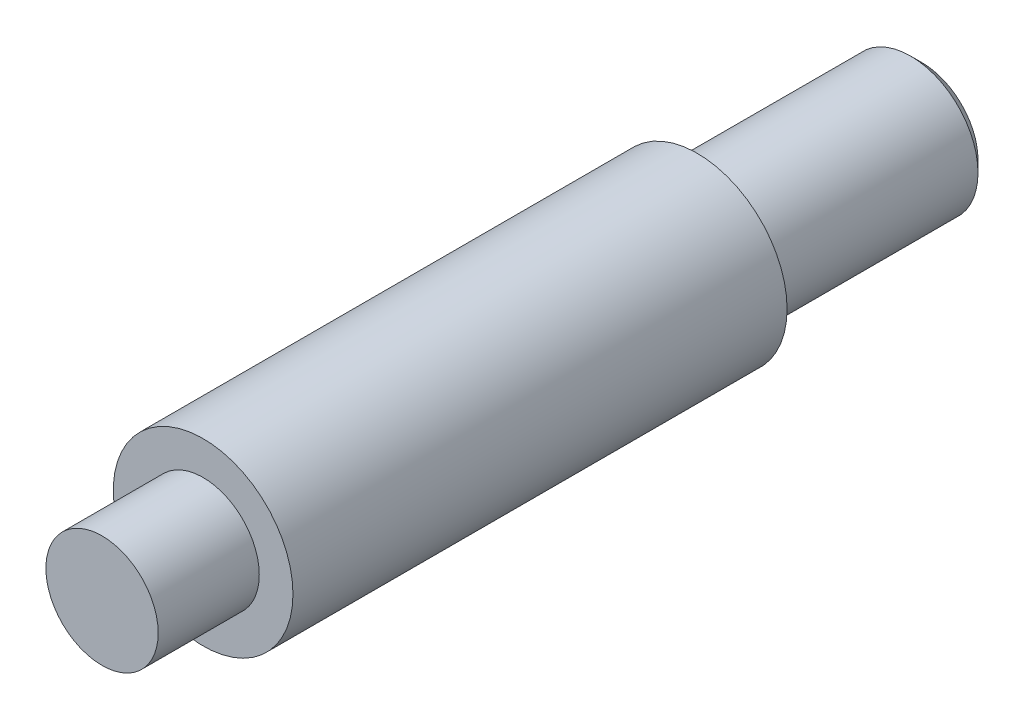
ISO-10303-21;
HEADER;
FILE_DESCRIPTION(('STEP AP214'),'2;1');
FILE_NAME('part.step','',(''),(''),'','','');
FILE_SCHEMA(('AUTOMOTIVE_DESIGN { 1 0 10303 214 1 1 1 1 }'));
ENDSEC;
DATA;
#1=APPLICATION_CONTEXT('core data for automotive mechanical design processes');
#2=APPLICATION_PROTOCOL_DEFINITION('international standard','automotive_design',2000,#1);
#3=PRODUCT_CONTEXT('',#1,'mechanical');
#4=PRODUCT('Part','Part','',(#3));
#5=PRODUCT_RELATED_PRODUCT_CATEGORY('part','',(#4));
#6=PRODUCT_DEFINITION_FORMATION('','',#4);
#7=PRODUCT_DEFINITION_CONTEXT('part definition',#1,'design');
#8=PRODUCT_DEFINITION('design','',#6,#7);
#9=PRODUCT_DEFINITION_SHAPE('','',#8);
#10=(LENGTH_UNIT() NAMED_UNIT(*) SI_UNIT(.MILLI.,.METRE.));
#11=(NAMED_UNIT(*) PLANE_ANGLE_UNIT() SI_UNIT($,.RADIAN.));
#12=(NAMED_UNIT(*) SI_UNIT($,.STERADIAN.) SOLID_ANGLE_UNIT());
#13=UNCERTAINTY_MEASURE_WITH_UNIT(LENGTH_MEASURE(1.E-05),#10,'distance_accuracy_value','');
#14=(GEOMETRIC_REPRESENTATION_CONTEXT(3) GLOBAL_UNCERTAINTY_ASSIGNED_CONTEXT((#13)) GLOBAL_UNIT_ASSIGNED_CONTEXT((#10,
#11,#12)) REPRESENTATION_CONTEXT('',''));
#15=CARTESIAN_POINT('',(0.,0.,0.));
#16=DIRECTION('',(0.,0.,1.));
#17=DIRECTION('',(1.,0.,0.));
#18=AXIS2_PLACEMENT_3D('',#15,#16,#17);
#19=CARTESIAN_POINT('',(0.,0.,0.));
#20=DIRECTION('',(0.,0.,1.));
#21=DIRECTION('',(1.,0.,0.));
#22=AXIS2_PLACEMENT_3D('',#19,#20,#21);
#23=PLANE('',#22);
#24=CARTESIAN_POINT('',(0.,0.,0.));
#25=DIRECTION('',(0.,0.,1.));
#26=DIRECTION('',(1.,0.,0.));
#27=AXIS2_PLACEMENT_3D('',#24,#25,#26);
#28=CIRCLE('',#27,8.);
#29=CARTESIAN_POINT('',(8.,0.,0.));
#30=VERTEX_POINT('',#29);
#31=EDGE_CURVE('E53',#30,#30,#28,.T.);
#32=ORIENTED_EDGE('',*,*,#31,.F.);
#33=EDGE_LOOP('',(#32));
#34=FACE_BOUND('',#33,.T.);
#35=CARTESIAN_POINT('',(0.,0.,0.));
#36=DIRECTION('',(0.,0.,1.));
#37=DIRECTION('',(1.,0.,0.));
#38=AXIS2_PLACEMENT_3D('',#35,#36,#37);
#39=CIRCLE('',#38,6.);
#40=CARTESIAN_POINT('',(6.,0.,0.));
#41=VERTEX_POINT('',#40);
#42=EDGE_CURVE('E44',#41,#41,#39,.F.);
#43=ORIENTED_EDGE('',*,*,#42,.F.);
#44=EDGE_LOOP('',(#43));
#45=FACE_BOUND('',#44,.T.);
#46=ADVANCED_FACE('F33',(#34,#45),#23,.F.);
#47=CARTESIAN_POINT('',(0.,0.,44.));
#48=DIRECTION('',(0.,0.,1.));
#49=DIRECTION('',(1.,0.,0.));
#50=AXIS2_PLACEMENT_3D('',#47,#48,#49);
#51=PLANE('',#50);
#52=CARTESIAN_POINT('',(0.,0.,44.));
#53=DIRECTION('',(0.,0.,1.));
#54=DIRECTION('',(1.,0.,0.));
#55=AXIS2_PLACEMENT_3D('',#52,#53,#54);
#56=CIRCLE('',#55,8.);
#57=CARTESIAN_POINT('',(8.,0.,44.));
#58=VERTEX_POINT('',#57);
#59=EDGE_CURVE('E48',#58,#58,#56,.T.);
#60=ORIENTED_EDGE('',*,*,#59,.T.);
#61=EDGE_LOOP('',(#60));
#62=FACE_BOUND('',#61,.T.);
#63=CARTESIAN_POINT('',(0.,0.,44.));
#64=DIRECTION('',(0.,0.,1.));
#65=DIRECTION('',(1.,0.,0.));
#66=AXIS2_PLACEMENT_3D('',#63,#64,#65);
#67=CIRCLE('',#66,5.);
#68=CARTESIAN_POINT('',(5.,0.,44.));
#69=VERTEX_POINT('',#68);
#70=EDGE_CURVE('E59',#69,#69,#67,.T.);
#71=ORIENTED_EDGE('',*,*,#70,.F.);
#72=EDGE_LOOP('',(#71));
#73=FACE_BOUND('',#72,.T.);
#74=ADVANCED_FACE('F65',(#62,#73),#51,.T.);
#75=CARTESIAN_POINT('',(0.,0.,44.));
#76=DIRECTION('',(0.,0.,-1.));
#77=DIRECTION('',(-1.,0.,0.));
#78=AXIS2_PLACEMENT_3D('',#75,#76,#77);
#79=CYLINDRICAL_SURFACE('',#78,8.);
#80=ORIENTED_EDGE('',*,*,#59,.F.);
#81=EDGE_LOOP('',(#80));
#82=FACE_BOUND('',#81,.T.);
#83=ORIENTED_EDGE('',*,*,#31,.T.);
#84=EDGE_LOOP('',(#83));
#85=FACE_BOUND('',#84,.T.);
#86=ADVANCED_FACE('F35',(#82,#85),#79,.T.);
#87=CARTESIAN_POINT('',(0.,0.,53.));
#88=DIRECTION('',(0.,0.,-1.));
#89=DIRECTION('',(-1.,0.,0.));
#90=AXIS2_PLACEMENT_3D('',#87,#88,#89);
#91=CYLINDRICAL_SURFACE('',#90,5.);
#92=CARTESIAN_POINT('',(0.,0.,53.));
#93=DIRECTION('',(0.,0.,1.));
#94=DIRECTION('',(1.,0.,0.));
#95=AXIS2_PLACEMENT_3D('',#92,#93,#94);
#96=CIRCLE('',#95,5.);
#97=CARTESIAN_POINT('',(5.,0.,53.));
#98=VERTEX_POINT('',#97);
#99=EDGE_CURVE('E56',#98,#98,#96,.T.);
#100=ORIENTED_EDGE('',*,*,#99,.F.);
#101=EDGE_LOOP('',(#100));
#102=FACE_BOUND('',#101,.T.);
#103=ORIENTED_EDGE('',*,*,#70,.T.);
#104=EDGE_LOOP('',(#103));
#105=FACE_BOUND('',#104,.T.);
#106=ADVANCED_FACE('F63',(#102,#105),#91,.T.);
#107=CARTESIAN_POINT('',(0.,0.,53.));
#108=DIRECTION('',(0.,0.,1.));
#109=DIRECTION('',(1.,0.,0.));
#110=AXIS2_PLACEMENT_3D('',#107,#108,#109);
#111=PLANE('',#110);
#112=ORIENTED_EDGE('',*,*,#99,.T.);
#113=EDGE_LOOP('',(#112));
#114=FACE_BOUND('',#113,.T.);
#115=ADVANCED_FACE('F78',(#114),#111,.T.);
#116=CARTESIAN_POINT('',(0.,0.,-20.));
#117=DIRECTION('',(0.,0.,1.));
#118=DIRECTION('',(1.,0.,0.));
#119=AXIS2_PLACEMENT_3D('',#116,#117,#118);
#120=CYLINDRICAL_SURFACE('',#119,6.);
#121=CARTESIAN_POINT('',(0.,0.,-19.));
#122=DIRECTION('',(0.,0.,-1.));
#123=DIRECTION('',(-1.,0.,0.));
#124=AXIS2_PLACEMENT_3D('',#121,#122,#123);
#125=CIRCLE('',#124,6.);
#126=CARTESIAN_POINT('',(-6.,0.,-19.));
#127=VERTEX_POINT('',#126);
#128=EDGE_CURVE('E10',#127,#127,#125,.F.);
#129=ORIENTED_EDGE('',*,*,#128,.T.);
#130=EDGE_LOOP('',(#129));
#131=FACE_BOUND('',#130,.T.);
#132=ORIENTED_EDGE('',*,*,#42,.T.);
#133=EDGE_LOOP('',(#132));
#134=FACE_BOUND('',#133,.T.);
#135=ADVANCED_FACE('F82',(#131,#134),#120,.T.);
#136=CARTESIAN_POINT('',(0.,0.,-20.));
#137=DIRECTION('',(0.,0.,-1.));
#138=DIRECTION('',(-1.,0.,0.));
#139=AXIS2_PLACEMENT_3D('',#136,#137,#138);
#140=PLANE('',#139);
#141=CARTESIAN_POINT('',(0.,0.,-20.));
#142=DIRECTION('',(0.,0.,-1.));
#143=DIRECTION('',(-1.,0.,0.));
#144=AXIS2_PLACEMENT_3D('',#141,#142,#143);
#145=CIRCLE('',#144,5.);
#146=CARTESIAN_POINT('',(-5.,0.,-20.));
#147=VERTEX_POINT('',#146);
#148=EDGE_CURVE('E40',#147,#147,#145,.T.);
#149=ORIENTED_EDGE('',*,*,#148,.T.);
#150=EDGE_LOOP('',(#149));
#151=FACE_BOUND('',#150,.T.);
#152=ADVANCED_FACE('F86',(#151),#140,.T.);
#153=CARTESIAN_POINT('',(0.,0.,-20.));
#154=DIRECTION('',(0.,0.,1.));
#155=DIRECTION('',(1.,0.,0.));
#156=AXIS2_PLACEMENT_3D('',#153,#154,#155);
#157=CONICAL_SURFACE('',#156,5.,0.785398163397447);
#158=ORIENTED_EDGE('',*,*,#128,.F.);
#159=EDGE_LOOP('',(#158));
#160=FACE_BOUND('',#159,.T.);
#161=ORIENTED_EDGE('',*,*,#148,.F.);
#162=EDGE_LOOP('',(#161));
#163=FACE_BOUND('',#162,.T.);
#164=ADVANCED_FACE('F89',(#160,#163),#157,.T.);
#165=CLOSED_SHELL('',(#46,#74,#86,#106,#115,#135,#152,#164));
#166=MANIFOLD_SOLID_BREP('B2',#165);
#167=ADVANCED_BREP_SHAPE_REPRESENTATION('',(#18,#166),#14);
#168=SHAPE_DEFINITION_REPRESENTATION(#9,#167);
ENDSEC;
END-ISO-10303-21;
